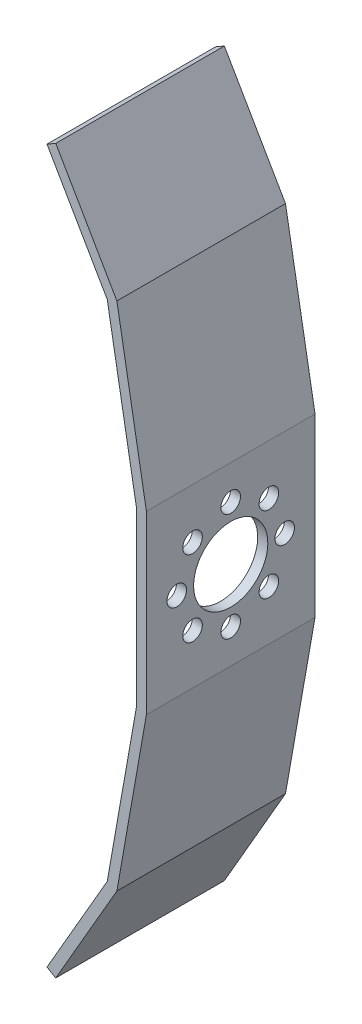
ISO-10303-21;
HEADER;
FILE_DESCRIPTION(('STEP AP214'),'2;1');
FILE_NAME('part.step','',(''),(''),'','','');
FILE_SCHEMA(('AUTOMOTIVE_DESIGN { 1 0 10303 214 1 1 1 1 }'));
ENDSEC;
DATA;
#1=APPLICATION_CONTEXT('core data for automotive mechanical design processes');
#2=APPLICATION_PROTOCOL_DEFINITION('international standard','automotive_design',2000,#1);
#3=PRODUCT_CONTEXT('',#1,'mechanical');
#4=PRODUCT('Part','Part','',(#3));
#5=PRODUCT_RELATED_PRODUCT_CATEGORY('part','',(#4));
#6=PRODUCT_DEFINITION_FORMATION('','',#4);
#7=PRODUCT_DEFINITION_CONTEXT('part definition',#1,'design');
#8=PRODUCT_DEFINITION('design','',#6,#7);
#9=PRODUCT_DEFINITION_SHAPE('','',#8);
#10=(LENGTH_UNIT() NAMED_UNIT(*) SI_UNIT(.MILLI.,.METRE.));
#11=(NAMED_UNIT(*) PLANE_ANGLE_UNIT() SI_UNIT($,.RADIAN.));
#12=(NAMED_UNIT(*) SI_UNIT($,.STERADIAN.) SOLID_ANGLE_UNIT());
#13=UNCERTAINTY_MEASURE_WITH_UNIT(LENGTH_MEASURE(1.E-05),#10,'distance_accuracy_value','');
#14=(GEOMETRIC_REPRESENTATION_CONTEXT(3) GLOBAL_UNCERTAINTY_ASSIGNED_CONTEXT((#13)) GLOBAL_UNIT_ASSIGNED_CONTEXT((#10,
#11,#12)) REPRESENTATION_CONTEXT('',''));
#15=CARTESIAN_POINT('',(0.,0.,0.));
#16=DIRECTION('',(0.,0.,1.));
#17=DIRECTION('',(1.,0.,0.));
#18=AXIS2_PLACEMENT_3D('',#15,#16,#17);
#19=CARTESIAN_POINT('',(-4.9907234945116,-37.2451938253052,25.));
#20=DIRECTION('',(0.866025403784438,-0.500000000000001,0.));
#21=DIRECTION('',(0.500000000000001,0.866025403784438,0.));
#22=AXIS2_PLACEMENT_3D('',#19,#20,#21);
#23=PLANE('',#22);
#24=DIRECTION('',(-0.500000000000001,-0.866025403784438,0.));
#25=VECTOR('',#24,1.);
#26=CARTESIAN_POINT('',(-4.9907234945116,-37.2451938253052,0.));
#27=LINE('',#26,#25);
#28=CARTESIAN_POINT('',(-5.05684611227727,-37.3597215588048,0.));
#29=VERTEX_POINT('',#28);
#30=CARTESIAN_POINT('',(-13.9907234945116,-52.8336510934251,0.));
#31=VERTEX_POINT('',#30);
#32=EDGE_CURVE('E161',#29,#31,#27,.T.);
#33=ORIENTED_EDGE('',*,*,#32,.T.);
#34=DIRECTION('',(0.,0.,-1.));
#35=VECTOR('',#34,1.);
#36=CARTESIAN_POINT('',(-13.9907234945116,-52.8336510934251,25.));
#37=LINE('',#36,#35);
#38=CARTESIAN_POINT('',(-13.9907234945116,-52.8336510934251,25.));
#39=VERTEX_POINT('',#38);
#40=EDGE_CURVE('E11',#39,#31,#37,.T.);
#41=ORIENTED_EDGE('',*,*,#40,.F.);
#42=DIRECTION('',(-0.500000000000001,-0.866025403784438,0.));
#43=VECTOR('',#42,1.);
#44=CARTESIAN_POINT('',(-4.9907234945116,-37.2451938253052,25.));
#45=LINE('',#44,#43);
#46=CARTESIAN_POINT('',(-5.05684611227727,-37.3597215588048,25.));
#47=VERTEX_POINT('',#46);
#48=EDGE_CURVE('E109',#47,#39,#45,.T.);
#49=ORIENTED_EDGE('',*,*,#48,.F.);
#50=DIRECTION('',(0.,0.,-1.));
#51=VECTOR('',#50,1.);
#52=CARTESIAN_POINT('',(-5.05684611227727,-37.3597215588048,25.));
#53=LINE('',#52,#51);
#54=EDGE_CURVE('E157',#47,#29,#53,.T.);
#55=ORIENTED_EDGE('',*,*,#54,.T.);
#56=EDGE_LOOP('',(#33,#41,#49,#55));
#57=FACE_BOUND('',#56,.T.);
#58=ADVANCED_FACE('F39',(#57),#23,.F.);
#59=CARTESIAN_POINT('',(-12.691685388835,-53.5836510934251,25.));
#60=DIRECTION('',(-0.500000000000001,-0.866025403784438,0.));
#61=DIRECTION('',(0.866025403784438,-0.500000000000001,0.));
#62=AXIS2_PLACEMENT_3D('',#59,#60,#61);
#63=PLANE('',#62);
#64=DIRECTION('',(-0.866025403784438,0.500000000000001,0.));
#65=VECTOR('',#64,1.);
#66=CARTESIAN_POINT('',(-12.691685388835,-53.5836510934251,0.));
#67=LINE('',#66,#65);
#68=CARTESIAN_POINT('',(-12.691685388835,-53.5836510934251,0.));
#69=VERTEX_POINT('',#68);
#70=EDGE_CURVE('E164',#69,#31,#67,.T.);
#71=ORIENTED_EDGE('',*,*,#70,.F.);
#72=DIRECTION('',(0.,0.,-1.));
#73=VECTOR('',#72,1.);
#74=CARTESIAN_POINT('',(-12.691685388835,-53.5836510934251,25.));
#75=LINE('',#74,#73);
#76=CARTESIAN_POINT('',(-12.691685388835,-53.5836510934251,25.));
#77=VERTEX_POINT('',#76);
#78=EDGE_CURVE('E48',#77,#69,#75,.T.);
#79=ORIENTED_EDGE('',*,*,#78,.F.);
#80=DIRECTION('',(-0.866025403784438,0.500000000000001,0.));
#81=VECTOR('',#80,1.);
#82=CARTESIAN_POINT('',(-12.691685388835,-53.5836510934251,25.));
#83=LINE('',#82,#81);
#84=EDGE_CURVE('E262',#77,#39,#83,.T.);
#85=ORIENTED_EDGE('',*,*,#84,.T.);
#86=ORIENTED_EDGE('',*,*,#40,.T.);
#87=EDGE_LOOP('',(#71,#79,#85,#86));
#88=FACE_BOUND('',#87,.T.);
#89=ADVANCED_FACE('F249',(#88),#63,.T.);
#90=CARTESIAN_POINT('',(-3.69168538883494,-37.9951938253052,25.));
#91=DIRECTION('',(0.866025403784438,-0.500000000000001,0.));
#92=DIRECTION('',(0.500000000000001,0.866025403784438,0.));
#93=AXIS2_PLACEMENT_3D('',#90,#91,#92);
#94=PLANE('',#93);
#95=DIRECTION('',(-0.500000000000001,-0.866025403784438,0.));
#96=VECTOR('',#95,1.);
#97=CARTESIAN_POINT('',(-3.69168538883494,-37.9951938253052,0.));
#98=LINE('',#97,#96);
#99=CARTESIAN_POINT('',(-3.62556277106927,-37.8806660918056,0.));
#100=VERTEX_POINT('',#99);
#101=EDGE_CURVE('E167',#100,#69,#98,.T.);
#102=ORIENTED_EDGE('',*,*,#101,.F.);
#103=DIRECTION('',(0.,0.,-1.));
#104=VECTOR('',#103,1.);
#105=CARTESIAN_POINT('',(-3.62556277106927,-37.8806660918056,25.));
#106=LINE('',#105,#104);
#107=CARTESIAN_POINT('',(-3.62556277106927,-37.8806660918056,25.));
#108=VERTEX_POINT('',#107);
#109=EDGE_CURVE('E203',#108,#100,#106,.T.);
#110=ORIENTED_EDGE('',*,*,#109,.F.);
#111=DIRECTION('',(-0.500000000000001,-0.866025403784438,0.));
#112=VECTOR('',#111,1.);
#113=CARTESIAN_POINT('',(-3.69168538883494,-37.9951938253052,25.));
#114=LINE('',#113,#112);
#115=EDGE_CURVE('E265',#108,#77,#114,.T.);
#116=ORIENTED_EDGE('',*,*,#115,.T.);
#117=ORIENTED_EDGE('',*,*,#78,.T.);
#118=EDGE_LOOP('',(#102,#110,#116,#117));
#119=FACE_BOUND('',#118,.T.);
#120=ADVANCED_FACE('F254',(#119),#94,.T.);
#121=CARTESIAN_POINT('',(0.738605814759159,-13.1302361332502,25.));
#122=DIRECTION('',(0.984807753012208,-0.173648177666931,0.));
#123=DIRECTION('',(0.173648177666931,0.984807753012208,0.));
#124=AXIS2_PLACEMENT_3D('',#121,#122,#123);
#125=PLANE('',#124);
#126=DIRECTION('',(-0.173648177666931,-0.984807753012208,0.));
#127=VECTOR('',#126,1.);
#128=CARTESIAN_POINT('',(0.738605814759159,-13.1302361332502,0.));
#129=LINE('',#128,#127);
#130=CARTESIAN_POINT('',(0.750000000000003,-13.0656164976444,0.));
#131=VERTEX_POINT('',#130);
#132=EDGE_CURVE('E170',#131,#100,#129,.T.);
#133=ORIENTED_EDGE('',*,*,#132,.F.);
#134=DIRECTION('',(0.,0.,-1.));
#135=VECTOR('',#134,1.);
#136=CARTESIAN_POINT('',(0.750000000000003,-13.0656164976444,25.));
#137=LINE('',#136,#135);
#138=CARTESIAN_POINT('',(0.750000000000003,-13.0656164976444,25.));
#139=VERTEX_POINT('',#138);
#140=EDGE_CURVE('E201',#139,#131,#137,.T.);
#141=ORIENTED_EDGE('',*,*,#140,.F.);
#142=DIRECTION('',(-0.173648177666931,-0.984807753012208,0.));
#143=VECTOR('',#142,1.);
#144=CARTESIAN_POINT('',(0.738605814759159,-13.1302361332502,25.));
#145=LINE('',#144,#143);
#146=EDGE_CURVE('E267',#139,#108,#145,.T.);
#147=ORIENTED_EDGE('',*,*,#146,.T.);
#148=ORIENTED_EDGE('',*,*,#109,.T.);
#149=EDGE_LOOP('',(#133,#141,#147,#148));
#150=FACE_BOUND('',#149,.T.);
#151=ADVANCED_FACE('F317',(#150),#125,.T.);
#152=CARTESIAN_POINT('',(0.75,13.,25.));
#153=DIRECTION('',(1.,0.,0.));
#154=DIRECTION('',(0.,1.,0.));
#155=AXIS2_PLACEMENT_3D('',#152,#153,#154);
#156=PLANE('',#155);
#157=CARTESIAN_POINT('',(0.750000000000002,0.,20.5));
#158=DIRECTION('',(1.,0.,0.));
#159=DIRECTION('',(0.,1.,0.));
#160=AXIS2_PLACEMENT_3D('',#157,#158,#159);
#161=CIRCLE('',#160,1.45);
#162=CARTESIAN_POINT('',(0.750000000000001,1.45,20.5));
#163=VERTEX_POINT('',#162);
#164=EDGE_CURVE('E505',#163,#163,#161,.T.);
#165=ORIENTED_EDGE('',*,*,#164,.F.);
#166=EDGE_LOOP('',(#165));
#167=FACE_BOUND('',#166,.T.);
#168=CARTESIAN_POINT('',(0.750000000000001,5.65685424949247,18.1568542494923));
#169=DIRECTION('',(1.,0.,0.));
#170=DIRECTION('',(0.,1.,0.));
#171=AXIS2_PLACEMENT_3D('',#168,#169,#170);
#172=CIRCLE('',#171,1.45);
#173=CARTESIAN_POINT('',(0.750000000000001,7.10685424949247,18.1568542494923));
#174=VERTEX_POINT('',#173);
#175=EDGE_CURVE('E501',#174,#174,#172,.T.);
#176=ORIENTED_EDGE('',*,*,#175,.F.);
#177=EDGE_LOOP('',(#176));
#178=FACE_BOUND('',#177,.T.);
#179=CARTESIAN_POINT('',(0.750000000000001,8.,12.5));
#180=DIRECTION('',(1.,0.,0.));
#181=DIRECTION('',(0.,1.,0.));
#182=AXIS2_PLACEMENT_3D('',#179,#180,#181);
#183=CIRCLE('',#182,1.45);
#184=CARTESIAN_POINT('',(0.75,9.45,12.5));
#185=VERTEX_POINT('',#184);
#186=EDGE_CURVE('E479',#185,#185,#183,.T.);
#187=ORIENTED_EDGE('',*,*,#186,.F.);
#188=EDGE_LOOP('',(#187));
#189=FACE_BOUND('',#188,.T.);
#190=CARTESIAN_POINT('',(0.750000000000001,5.65685424949235,6.84314575050759));
#191=DIRECTION('',(1.,0.,0.));
#192=DIRECTION('',(0.,1.,0.));
#193=AXIS2_PLACEMENT_3D('',#190,#191,#192);
#194=CIRCLE('',#193,1.45);
#195=CARTESIAN_POINT('',(0.750000000000001,7.10685424949235,6.84314575050759));
#196=VERTEX_POINT('',#195);
#197=EDGE_CURVE('E502',#196,#196,#194,.T.);
#198=ORIENTED_EDGE('',*,*,#197,.F.);
#199=EDGE_LOOP('',(#198));
#200=FACE_BOUND('',#199,.T.);
#201=CARTESIAN_POINT('',(0.750000000000002,0.,4.5));
#202=DIRECTION('',(1.,0.,0.));
#203=DIRECTION('',(0.,1.,0.));
#204=AXIS2_PLACEMENT_3D('',#201,#202,#203);
#205=CIRCLE('',#204,1.45);
#206=CARTESIAN_POINT('',(0.750000000000001,1.44999999999994,4.5));
#207=VERTEX_POINT('',#206);
#208=EDGE_CURVE('E508',#207,#207,#205,.T.);
#209=ORIENTED_EDGE('',*,*,#208,.F.);
#210=EDGE_LOOP('',(#209));
#211=FACE_BOUND('',#210,.T.);
#212=CARTESIAN_POINT('',(0.750000000000002,-5.65685424949243,6.84314575050767));
#213=DIRECTION('',(1.,0.,0.));
#214=DIRECTION('',(0.,1.,0.));
#215=AXIS2_PLACEMENT_3D('',#212,#213,#214);
#216=CIRCLE('',#215,1.45);
#217=CARTESIAN_POINT('',(0.750000000000002,-4.20685424949243,6.84314575050767));
#218=VERTEX_POINT('',#217);
#219=EDGE_CURVE('E521',#218,#218,#216,.T.);
#220=ORIENTED_EDGE('',*,*,#219,.F.);
#221=EDGE_LOOP('',(#220));
#222=FACE_BOUND('',#221,.T.);
#223=CARTESIAN_POINT('',(0.750000000000003,-8.,12.5000000000001));
#224=DIRECTION('',(1.,0.,0.));
#225=DIRECTION('',(0.,1.,0.));
#226=AXIS2_PLACEMENT_3D('',#223,#224,#225);
#227=CIRCLE('',#226,1.45);
#228=CARTESIAN_POINT('',(0.750000000000002,-6.55,12.5000000000001));
#229=VERTEX_POINT('',#228);
#230=EDGE_CURVE('E518',#229,#229,#227,.T.);
#231=ORIENTED_EDGE('',*,*,#230,.F.);
#232=EDGE_LOOP('',(#231));
#233=FACE_BOUND('',#232,.T.);
#234=CARTESIAN_POINT('',(0.750000000000002,-5.65685424949231,18.1568542494925));
#235=DIRECTION('',(1.,0.,0.));
#236=DIRECTION('',(0.,1.,0.));
#237=AXIS2_PLACEMENT_3D('',#234,#235,#236);
#238=CIRCLE('',#237,1.45);
#239=CARTESIAN_POINT('',(0.750000000000002,-4.20685424949231,18.1568542494925));
#240=VERTEX_POINT('',#239);
#241=EDGE_CURVE('E515',#240,#240,#238,.T.);
#242=ORIENTED_EDGE('',*,*,#241,.F.);
#243=EDGE_LOOP('',(#242));
#244=FACE_BOUND('',#243,.T.);
#245=CARTESIAN_POINT('',(0.750000000000002,0.,12.5));
#246=DIRECTION('',(1.,0.,0.));
#247=DIRECTION('',(0.,1.,0.));
#248=AXIS2_PLACEMENT_3D('',#245,#246,#247);
#249=CIRCLE('',#248,5.5);
#250=CARTESIAN_POINT('',(0.750000000000001,5.5,12.5));
#251=VERTEX_POINT('',#250);
#252=EDGE_CURVE('E210',#251,#251,#249,.T.);
#253=ORIENTED_EDGE('',*,*,#252,.F.);
#254=EDGE_LOOP('',(#253));
#255=FACE_BOUND('',#254,.T.);
#256=DIRECTION('',(0.,-1.,0.));
#257=VECTOR('',#256,1.);
#258=CARTESIAN_POINT('',(0.75,13.,0.));
#259=LINE('',#258,#257);
#260=CARTESIAN_POINT('',(0.75,13.0656164976445,0.));
#261=VERTEX_POINT('',#260);
#262=EDGE_CURVE('E173',#261,#131,#259,.T.);
#263=ORIENTED_EDGE('',*,*,#262,.F.);
#264=DIRECTION('',(0.,0.,-1.));
#265=VECTOR('',#264,1.);
#266=CARTESIAN_POINT('',(0.75,13.0656164976445,25.));
#267=LINE('',#266,#265);
#268=CARTESIAN_POINT('',(0.75,13.0656164976445,25.));
#269=VERTEX_POINT('',#268);
#270=EDGE_CURVE('E199',#269,#261,#267,.T.);
#271=ORIENTED_EDGE('',*,*,#270,.F.);
#272=DIRECTION('',(0.,-1.,0.));
#273=VECTOR('',#272,1.);
#274=CARTESIAN_POINT('',(0.75,13.,25.));
#275=LINE('',#274,#273);
#276=EDGE_CURVE('E274',#269,#139,#275,.T.);
#277=ORIENTED_EDGE('',*,*,#276,.T.);
#278=ORIENTED_EDGE('',*,*,#140,.T.);
#279=EDGE_LOOP('',(#263,#271,#277,#278));
#280=FACE_BOUND('',#279,.T.);
#281=ADVANCED_FACE('F313',(#167,#178,#189,#200,#211,#222,#233,#244,#255,#280),#156,.T.);
#282=CARTESIAN_POINT('',(-3.60259862691413,37.7504299585554,25.));
#283=DIRECTION('',(0.984807753012208,0.173648177666931,0.));
#284=DIRECTION('',(-0.173648177666931,0.984807753012208,0.));
#285=AXIS2_PLACEMENT_3D('',#282,#283,#284);
#286=PLANE('',#285);
#287=DIRECTION('',(0.173648177666931,-0.984807753012208,0.));
#288=VECTOR('',#287,1.);
#289=CARTESIAN_POINT('',(-3.60259862691413,37.7504299585554,0.));
#290=LINE('',#289,#288);
#291=CARTESIAN_POINT('',(-3.62556277106928,37.8806660918056,0.));
#292=VERTEX_POINT('',#291);
#293=EDGE_CURVE('E176',#292,#261,#290,.T.);
#294=ORIENTED_EDGE('',*,*,#293,.F.);
#295=DIRECTION('',(0.,0.,-1.));
#296=VECTOR('',#295,1.);
#297=CARTESIAN_POINT('',(-3.62556277106928,37.8806660918056,25.));
#298=LINE('',#297,#296);
#299=CARTESIAN_POINT('',(-3.62556277106928,37.8806660918056,25.));
#300=VERTEX_POINT('',#299);
#301=EDGE_CURVE('E197',#300,#292,#298,.T.);
#302=ORIENTED_EDGE('',*,*,#301,.F.);
#303=DIRECTION('',(0.173648177666931,-0.984807753012208,0.));
#304=VECTOR('',#303,1.);
#305=CARTESIAN_POINT('',(-3.60259862691413,37.7504299585554,25.));
#306=LINE('',#305,#304);
#307=EDGE_CURVE('E277',#300,#269,#306,.T.);
#308=ORIENTED_EDGE('',*,*,#307,.T.);
#309=ORIENTED_EDGE('',*,*,#270,.T.);
#310=EDGE_LOOP('',(#294,#302,#308,#309));
#311=FACE_BOUND('',#310,.T.);
#312=ADVANCED_FACE('F310',(#311),#286,.T.);
#313=CARTESIAN_POINT('',(-12.691685388835,53.5836510934251,25.));
#314=DIRECTION('',(0.866025403784437,0.500000000000002,0.));
#315=DIRECTION('',(-0.500000000000002,0.866025403784437,0.));
#316=AXIS2_PLACEMENT_3D('',#313,#314,#315);
#317=PLANE('',#316);
#318=DIRECTION('',(0.500000000000002,-0.866025403784437,0.));
#319=VECTOR('',#318,1.);
#320=CARTESIAN_POINT('',(-12.691685388835,53.5836510934251,0.));
#321=LINE('',#320,#319);
#322=CARTESIAN_POINT('',(-12.691685388835,53.5836510934251,0.));
#323=VERTEX_POINT('',#322);
#324=EDGE_CURVE('E179',#323,#292,#321,.T.);
#325=ORIENTED_EDGE('',*,*,#324,.F.);
#326=DIRECTION('',(0.,0.,-1.));
#327=VECTOR('',#326,1.);
#328=CARTESIAN_POINT('',(-12.691685388835,53.5836510934251,25.));
#329=LINE('',#328,#327);
#330=CARTESIAN_POINT('',(-12.691685388835,53.5836510934251,25.));
#331=VERTEX_POINT('',#330);
#332=EDGE_CURVE('E195',#331,#323,#329,.T.);
#333=ORIENTED_EDGE('',*,*,#332,.F.);
#334=DIRECTION('',(0.500000000000002,-0.866025403784437,0.));
#335=VECTOR('',#334,1.);
#336=CARTESIAN_POINT('',(-12.691685388835,53.5836510934251,25.));
#337=LINE('',#336,#335);
#338=EDGE_CURVE('E280',#331,#300,#337,.T.);
#339=ORIENTED_EDGE('',*,*,#338,.T.);
#340=ORIENTED_EDGE('',*,*,#301,.T.);
#341=EDGE_LOOP('',(#325,#333,#339,#340));
#342=FACE_BOUND('',#341,.T.);
#343=ADVANCED_FACE('F293',(#342),#317,.T.);
#344=CARTESIAN_POINT('',(-13.9907234945117,52.8336510934251,25.));
#345=DIRECTION('',(-0.500000000000001,0.866025403784438,0.));
#346=DIRECTION('',(-0.866025403784438,-0.500000000000001,0.));
#347=AXIS2_PLACEMENT_3D('',#344,#345,#346);
#348=PLANE('',#347);
#349=DIRECTION('',(0.866025403784438,0.500000000000001,0.));
#350=VECTOR('',#349,1.);
#351=CARTESIAN_POINT('',(-13.9907234945117,52.8336510934251,0.));
#352=LINE('',#351,#350);
#353=CARTESIAN_POINT('',(-13.9907234945117,52.8336510934251,0.));
#354=VERTEX_POINT('',#353);
#355=EDGE_CURVE('E182',#354,#323,#352,.T.);
#356=ORIENTED_EDGE('',*,*,#355,.F.);
#357=DIRECTION('',(0.,0.,-1.));
#358=VECTOR('',#357,1.);
#359=CARTESIAN_POINT('',(-13.9907234945117,52.8336510934251,25.));
#360=LINE('',#359,#358);
#361=CARTESIAN_POINT('',(-13.9907234945117,52.8336510934251,25.));
#362=VERTEX_POINT('',#361);
#363=EDGE_CURVE('E193',#362,#354,#360,.T.);
#364=ORIENTED_EDGE('',*,*,#363,.F.);
#365=DIRECTION('',(0.866025403784438,0.500000000000001,0.));
#366=VECTOR('',#365,1.);
#367=CARTESIAN_POINT('',(-13.9907234945117,52.8336510934251,25.));
#368=LINE('',#367,#366);
#369=EDGE_CURVE('E283',#362,#331,#368,.T.);
#370=ORIENTED_EDGE('',*,*,#369,.T.);
#371=ORIENTED_EDGE('',*,*,#332,.T.);
#372=EDGE_LOOP('',(#356,#364,#370,#371));
#373=FACE_BOUND('',#372,.T.);
#374=ADVANCED_FACE('F287',(#373),#348,.T.);
#375=CARTESIAN_POINT('',(-13.9907234945117,52.8336510934251,25.));
#376=DIRECTION('',(0.866025403784437,0.500000000000002,0.));
#377=DIRECTION('',(-0.500000000000002,0.866025403784437,0.));
#378=AXIS2_PLACEMENT_3D('',#375,#376,#377);
#379=PLANE('',#378);
#380=DIRECTION('',(0.500000000000002,-0.866025403784437,0.));
#381=VECTOR('',#380,1.);
#382=CARTESIAN_POINT('',(-13.9907234945117,52.8336510934251,0.));
#383=LINE('',#382,#381);
#384=CARTESIAN_POINT('',(-5.05684611227729,37.3597215588048,0.));
#385=VERTEX_POINT('',#384);
#386=EDGE_CURVE('E185',#354,#385,#383,.T.);
#387=ORIENTED_EDGE('',*,*,#386,.T.);
#388=DIRECTION('',(0.,0.,-1.));
#389=VECTOR('',#388,1.);
#390=CARTESIAN_POINT('',(-5.05684611227729,37.3597215588048,25.));
#391=LINE('',#390,#389);
#392=CARTESIAN_POINT('',(-5.05684611227729,37.3597215588048,25.));
#393=VERTEX_POINT('',#392);
#394=EDGE_CURVE('E152',#393,#385,#391,.T.);
#395=ORIENTED_EDGE('',*,*,#394,.F.);
#396=DIRECTION('',(0.500000000000002,-0.866025403784437,0.));
#397=VECTOR('',#396,1.);
#398=CARTESIAN_POINT('',(-13.9907234945117,52.8336510934251,25.));
#399=LINE('',#398,#397);
#400=EDGE_CURVE('E143',#362,#393,#399,.T.);
#401=ORIENTED_EDGE('',*,*,#400,.F.);
#402=ORIENTED_EDGE('',*,*,#363,.T.);
#403=EDGE_LOOP('',(#387,#395,#401,#402));
#404=FACE_BOUND('',#403,.T.);
#405=ADVANCED_FACE('F297',(#404),#379,.F.);
#406=CARTESIAN_POINT('',(-5.07981025643244,37.489957692055,25.));
#407=DIRECTION('',(0.984807753012208,0.173648177666931,0.));
#408=DIRECTION('',(-0.173648177666931,0.984807753012208,0.));
#409=AXIS2_PLACEMENT_3D('',#406,#407,#408);
#410=PLANE('',#409);
#411=DIRECTION('',(0.173648177666931,-0.984807753012208,0.));
#412=VECTOR('',#411,1.);
#413=CARTESIAN_POINT('',(-5.07981025643244,37.489957692055,0.));
#414=LINE('',#413,#412);
#415=CARTESIAN_POINT('',(-0.75,12.9343835023556,0.));
#416=VERTEX_POINT('',#415);
#417=EDGE_CURVE('E151',#385,#416,#414,.T.);
#418=ORIENTED_EDGE('',*,*,#417,.T.);
#419=DIRECTION('',(0.,0.,-1.));
#420=VECTOR('',#419,1.);
#421=CARTESIAN_POINT('',(-0.75,12.9343835023556,25.));
#422=LINE('',#421,#420);
#423=CARTESIAN_POINT('',(-0.75,12.9343835023556,25.));
#424=VERTEX_POINT('',#423);
#425=EDGE_CURVE('E148',#424,#416,#422,.T.);
#426=ORIENTED_EDGE('',*,*,#425,.F.);
#427=DIRECTION('',(0.173648177666931,-0.984807753012208,0.));
#428=VECTOR('',#427,1.);
#429=CARTESIAN_POINT('',(-5.07981025643244,37.489957692055,25.));
#430=LINE('',#429,#428);
#431=EDGE_CURVE('E136',#393,#424,#430,.T.);
#432=ORIENTED_EDGE('',*,*,#431,.F.);
#433=ORIENTED_EDGE('',*,*,#394,.T.);
#434=EDGE_LOOP('',(#418,#426,#432,#433));
#435=FACE_BOUND('',#434,.T.);
#436=ADVANCED_FACE('F149',(#435),#410,.F.);
#437=CARTESIAN_POINT('',(-0.75,13.,25.));
#438=DIRECTION('',(1.,0.,0.));
#439=DIRECTION('',(0.,1.,0.));
#440=AXIS2_PLACEMENT_3D('',#437,#438,#439);
#441=PLANE('',#440);
#442=CARTESIAN_POINT('',(-0.749999999999999,0.,20.5));
#443=DIRECTION('',(1.,0.,0.));
#444=DIRECTION('',(0.,1.,0.));
#445=AXIS2_PLACEMENT_3D('',#442,#443,#444);
#446=CIRCLE('',#445,1.45);
#447=CARTESIAN_POINT('',(-0.749999999999999,1.45,20.5));
#448=VERTEX_POINT('',#447);
#449=EDGE_CURVE('E42',#448,#448,#446,.T.);
#450=ORIENTED_EDGE('',*,*,#449,.T.);
#451=EDGE_LOOP('',(#450));
#452=FACE_BOUND('',#451,.T.);
#453=CARTESIAN_POINT('',(-0.749999999999999,5.65685424949247,18.1568542494923));
#454=DIRECTION('',(1.,0.,0.));
#455=DIRECTION('',(0.,1.,0.));
#456=AXIS2_PLACEMENT_3D('',#453,#454,#455);
#457=CIRCLE('',#456,1.45);
#458=CARTESIAN_POINT('',(-0.749999999999999,7.10685424949247,18.1568542494923));
#459=VERTEX_POINT('',#458);
#460=EDGE_CURVE('E227',#459,#459,#457,.T.);
#461=ORIENTED_EDGE('',*,*,#460,.T.);
#462=EDGE_LOOP('',(#461));
#463=FACE_BOUND('',#462,.T.);
#464=CARTESIAN_POINT('',(-0.750000000000001,8.,12.5));
#465=DIRECTION('',(1.,0.,0.));
#466=DIRECTION('',(0.,1.,0.));
#467=AXIS2_PLACEMENT_3D('',#464,#465,#466);
#468=CIRCLE('',#467,1.45);
#469=CARTESIAN_POINT('',(-0.750000000000001,9.45,12.5));
#470=VERTEX_POINT('',#469);
#471=EDGE_CURVE('E225',#470,#470,#468,.T.);
#472=ORIENTED_EDGE('',*,*,#471,.T.);
#473=EDGE_LOOP('',(#472));
#474=FACE_BOUND('',#473,.T.);
#475=CARTESIAN_POINT('',(-0.749999999999999,5.65685424949235,6.84314575050759));
#476=DIRECTION('',(1.,0.,0.));
#477=DIRECTION('',(0.,1.,0.));
#478=AXIS2_PLACEMENT_3D('',#475,#476,#477);
#479=CIRCLE('',#478,1.45);
#480=CARTESIAN_POINT('',(-0.749999999999999,7.10685424949235,6.84314575050759));
#481=VERTEX_POINT('',#480);
#482=EDGE_CURVE('E222',#481,#481,#479,.T.);
#483=ORIENTED_EDGE('',*,*,#482,.T.);
#484=EDGE_LOOP('',(#483));
#485=FACE_BOUND('',#484,.T.);
#486=CARTESIAN_POINT('',(-0.749999999999999,0.,4.5));
#487=DIRECTION('',(1.,0.,0.));
#488=DIRECTION('',(0.,1.,0.));
#489=AXIS2_PLACEMENT_3D('',#486,#487,#488);
#490=CIRCLE('',#489,1.45);
#491=CARTESIAN_POINT('',(-0.749999999999999,1.44999999999994,4.5));
#492=VERTEX_POINT('',#491);
#493=EDGE_CURVE('E219',#492,#492,#490,.T.);
#494=ORIENTED_EDGE('',*,*,#493,.T.);
#495=EDGE_LOOP('',(#494));
#496=FACE_BOUND('',#495,.T.);
#497=CARTESIAN_POINT('',(-0.749999999999999,-5.65685424949243,6.84314575050767));
#498=DIRECTION('',(1.,0.,0.));
#499=DIRECTION('',(0.,1.,0.));
#500=AXIS2_PLACEMENT_3D('',#497,#498,#499);
#501=CIRCLE('',#500,1.45);
#502=CARTESIAN_POINT('',(-0.749999999999999,-4.20685424949243,6.84314575050767));
#503=VERTEX_POINT('',#502);
#504=EDGE_CURVE('E216',#503,#503,#501,.T.);
#505=ORIENTED_EDGE('',*,*,#504,.T.);
#506=EDGE_LOOP('',(#505));
#507=FACE_BOUND('',#506,.T.);
#508=CARTESIAN_POINT('',(-0.749999999999999,-8.,12.5000000000001));
#509=DIRECTION('',(1.,0.,0.));
#510=DIRECTION('',(0.,1.,0.));
#511=AXIS2_PLACEMENT_3D('',#508,#509,#510);
#512=CIRCLE('',#511,1.45);
#513=CARTESIAN_POINT('',(-0.749999999999999,-6.55,12.5000000000001));
#514=VERTEX_POINT('',#513);
#515=EDGE_CURVE('E213',#514,#514,#512,.T.);
#516=ORIENTED_EDGE('',*,*,#515,.T.);
#517=EDGE_LOOP('',(#516));
#518=FACE_BOUND('',#517,.T.);
#519=CARTESIAN_POINT('',(-0.749999999999999,-5.65685424949231,18.1568542494925));
#520=DIRECTION('',(1.,0.,0.));
#521=DIRECTION('',(0.,1.,0.));
#522=AXIS2_PLACEMENT_3D('',#519,#520,#521);
#523=CIRCLE('',#522,1.45);
#524=CARTESIAN_POINT('',(-0.749999999999999,-4.20685424949231,18.1568542494925));
#525=VERTEX_POINT('',#524);
#526=EDGE_CURVE('E209',#525,#525,#523,.T.);
#527=ORIENTED_EDGE('',*,*,#526,.T.);
#528=EDGE_LOOP('',(#527));
#529=FACE_BOUND('',#528,.T.);
#530=CARTESIAN_POINT('',(-0.749999999999999,0.,12.5));
#531=DIRECTION('',(1.,0.,0.));
#532=DIRECTION('',(0.,1.,0.));
#533=AXIS2_PLACEMENT_3D('',#530,#531,#532);
#534=CIRCLE('',#533,5.5);
#535=CARTESIAN_POINT('',(-0.75,5.5,12.5));
#536=VERTEX_POINT('',#535);
#537=EDGE_CURVE('E206',#536,#536,#534,.T.);
#538=ORIENTED_EDGE('',*,*,#537,.T.);
#539=EDGE_LOOP('',(#538));
#540=FACE_BOUND('',#539,.T.);
#541=DIRECTION('',(0.,-1.,0.));
#542=VECTOR('',#541,1.);
#543=CARTESIAN_POINT('',(-0.75,13.,0.));
#544=LINE('',#543,#542);
#545=CARTESIAN_POINT('',(-0.749999999999997,-12.9343835023556,0.));
#546=VERTEX_POINT('',#545);
#547=EDGE_CURVE('E97',#416,#546,#544,.T.);
#548=ORIENTED_EDGE('',*,*,#547,.T.);
#549=DIRECTION('',(0.,0.,-1.));
#550=VECTOR('',#549,1.);
#551=CARTESIAN_POINT('',(-0.749999999999997,-12.9343835023556,25.));
#552=LINE('',#551,#550);
#553=CARTESIAN_POINT('',(-0.749999999999997,-12.9343835023556,25.));
#554=VERTEX_POINT('',#553);
#555=EDGE_CURVE('E153',#554,#546,#552,.T.);
#556=ORIENTED_EDGE('',*,*,#555,.F.);
#557=DIRECTION('',(0.,-1.,0.));
#558=VECTOR('',#557,1.);
#559=CARTESIAN_POINT('',(-0.75,13.,25.));
#560=LINE('',#559,#558);
#561=EDGE_CURVE('E140',#424,#554,#560,.T.);
#562=ORIENTED_EDGE('',*,*,#561,.F.);
#563=ORIENTED_EDGE('',*,*,#425,.T.);
#564=EDGE_LOOP('',(#548,#556,#562,#563));
#565=FACE_BOUND('',#564,.T.);
#566=ADVANCED_FACE('F155',(#452,#463,#474,#485,#496,#507,#518,#529,#540,#565),#441,.F.);
#567=CARTESIAN_POINT('',(-0.738605814759153,-12.8697638667498,25.));
#568=DIRECTION('',(0.984807753012208,-0.173648177666931,0.));
#569=DIRECTION('',(0.173648177666931,0.984807753012208,0.));
#570=AXIS2_PLACEMENT_3D('',#567,#568,#569);
#571=PLANE('',#570);
#572=DIRECTION('',(-0.173648177666931,-0.984807753012208,0.));
#573=VECTOR('',#572,1.);
#574=CARTESIAN_POINT('',(-0.738605814759153,-12.8697638667498,0.));
#575=LINE('',#574,#573);
#576=EDGE_CURVE('E103',#546,#29,#575,.T.);
#577=ORIENTED_EDGE('',*,*,#576,.T.);
#578=ORIENTED_EDGE('',*,*,#54,.F.);
#579=DIRECTION('',(-0.173648177666931,-0.984807753012208,0.));
#580=VECTOR('',#579,1.);
#581=CARTESIAN_POINT('',(-0.738605814759153,-12.8697638667498,25.));
#582=LINE('',#581,#580);
#583=EDGE_CURVE('E57',#554,#47,#582,.T.);
#584=ORIENTED_EDGE('',*,*,#583,.F.);
#585=ORIENTED_EDGE('',*,*,#555,.T.);
#586=EDGE_LOOP('',(#577,#578,#584,#585));
#587=FACE_BOUND('',#586,.T.);
#588=ADVANCED_FACE('F371',(#587),#571,.F.);
#589=CARTESIAN_POINT('',(0.,0.,25.));
#590=DIRECTION('',(0.,0.,-1.));
#591=DIRECTION('',(-1.,0.,0.));
#592=AXIS2_PLACEMENT_3D('',#589,#590,#591);
#593=PLANE('',#592);
#594=ORIENTED_EDGE('',*,*,#48,.T.);
#595=ORIENTED_EDGE('',*,*,#84,.F.);
#596=ORIENTED_EDGE('',*,*,#115,.F.);
#597=ORIENTED_EDGE('',*,*,#146,.F.);
#598=ORIENTED_EDGE('',*,*,#276,.F.);
#599=ORIENTED_EDGE('',*,*,#307,.F.);
#600=ORIENTED_EDGE('',*,*,#338,.F.);
#601=ORIENTED_EDGE('',*,*,#369,.F.);
#602=ORIENTED_EDGE('',*,*,#400,.T.);
#603=ORIENTED_EDGE('',*,*,#431,.T.);
#604=ORIENTED_EDGE('',*,*,#561,.T.);
#605=ORIENTED_EDGE('',*,*,#583,.T.);
#606=EDGE_LOOP('',(#594,#595,#596,#597,#598,#599,#600,#601,#602,#603,#604,#605));
#607=FACE_BOUND('',#606,.T.);
#608=ADVANCED_FACE('F138',(#607),#593,.F.);
#609=CARTESIAN_POINT('',(0.,0.,0.));
#610=DIRECTION('',(0.,0.,-1.));
#611=DIRECTION('',(-1.,0.,0.));
#612=AXIS2_PLACEMENT_3D('',#609,#610,#611);
#613=PLANE('',#612);
#614=ORIENTED_EDGE('',*,*,#32,.F.);
#615=ORIENTED_EDGE('',*,*,#576,.F.);
#616=ORIENTED_EDGE('',*,*,#547,.F.);
#617=ORIENTED_EDGE('',*,*,#417,.F.);
#618=ORIENTED_EDGE('',*,*,#386,.F.);
#619=ORIENTED_EDGE('',*,*,#355,.T.);
#620=ORIENTED_EDGE('',*,*,#324,.T.);
#621=ORIENTED_EDGE('',*,*,#293,.T.);
#622=ORIENTED_EDGE('',*,*,#262,.T.);
#623=ORIENTED_EDGE('',*,*,#132,.T.);
#624=ORIENTED_EDGE('',*,*,#101,.T.);
#625=ORIENTED_EDGE('',*,*,#70,.T.);
#626=EDGE_LOOP('',(#614,#615,#616,#617,#618,#619,#620,#621,#622,#623,#624,#625));
#627=FACE_BOUND('',#626,.T.);
#628=ADVANCED_FACE('F260',(#627),#613,.T.);
#629=CARTESIAN_POINT('',(-9.25,0.,12.5));
#630=DIRECTION('',(1.,0.,0.));
#631=DIRECTION('',(0.,1.,0.));
#632=AXIS2_PLACEMENT_3D('',#629,#630,#631);
#633=CYLINDRICAL_SURFACE('',#632,5.5);
#634=ORIENTED_EDGE('',*,*,#252,.T.);
#635=EDGE_LOOP('',(#634));
#636=FACE_BOUND('',#635,.T.);
#637=ORIENTED_EDGE('',*,*,#537,.F.);
#638=EDGE_LOOP('',(#637));
#639=FACE_BOUND('',#638,.T.);
#640=ADVANCED_FACE('F390',(#636,#639),#633,.F.);
#641=CARTESIAN_POINT('',(-9.25,-5.65685424949231,18.1568542494925));
#642=DIRECTION('',(1.,0.,0.));
#643=DIRECTION('',(0.,1.,0.));
#644=AXIS2_PLACEMENT_3D('',#641,#642,#643);
#645=CYLINDRICAL_SURFACE('',#644,1.45);
#646=ORIENTED_EDGE('',*,*,#241,.T.);
#647=EDGE_LOOP('',(#646));
#648=FACE_BOUND('',#647,.T.);
#649=ORIENTED_EDGE('',*,*,#526,.F.);
#650=EDGE_LOOP('',(#649));
#651=FACE_BOUND('',#650,.T.);
#652=ADVANCED_FACE('F400',(#648,#651),#645,.F.);
#653=CARTESIAN_POINT('',(-9.25,-8.,12.5000000000001));
#654=DIRECTION('',(1.,0.,0.));
#655=DIRECTION('',(0.,1.,0.));
#656=AXIS2_PLACEMENT_3D('',#653,#654,#655);
#657=CYLINDRICAL_SURFACE('',#656,1.45);
#658=ORIENTED_EDGE('',*,*,#230,.T.);
#659=EDGE_LOOP('',(#658));
#660=FACE_BOUND('',#659,.T.);
#661=ORIENTED_EDGE('',*,*,#515,.F.);
#662=EDGE_LOOP('',(#661));
#663=FACE_BOUND('',#662,.T.);
#664=ADVANCED_FACE('F407',(#660,#663),#657,.F.);
#665=CARTESIAN_POINT('',(-9.25,-5.65685424949243,6.84314575050767));
#666=DIRECTION('',(1.,0.,0.));
#667=DIRECTION('',(0.,1.,0.));
#668=AXIS2_PLACEMENT_3D('',#665,#666,#667);
#669=CYLINDRICAL_SURFACE('',#668,1.45);
#670=ORIENTED_EDGE('',*,*,#219,.T.);
#671=EDGE_LOOP('',(#670));
#672=FACE_BOUND('',#671,.T.);
#673=ORIENTED_EDGE('',*,*,#504,.F.);
#674=EDGE_LOOP('',(#673));
#675=FACE_BOUND('',#674,.T.);
#676=ADVANCED_FACE('F414',(#672,#675),#669,.F.);
#677=CARTESIAN_POINT('',(-9.25,0.,4.5));
#678=DIRECTION('',(1.,0.,0.));
#679=DIRECTION('',(0.,1.,0.));
#680=AXIS2_PLACEMENT_3D('',#677,#678,#679);
#681=CYLINDRICAL_SURFACE('',#680,1.45);
#682=ORIENTED_EDGE('',*,*,#208,.T.);
#683=EDGE_LOOP('',(#682));
#684=FACE_BOUND('',#683,.T.);
#685=ORIENTED_EDGE('',*,*,#493,.F.);
#686=EDGE_LOOP('',(#685));
#687=FACE_BOUND('',#686,.T.);
#688=ADVANCED_FACE('F422',(#684,#687),#681,.F.);
#689=CARTESIAN_POINT('',(-9.25,5.65685424949235,6.84314575050759));
#690=DIRECTION('',(1.,0.,0.));
#691=DIRECTION('',(0.,1.,0.));
#692=AXIS2_PLACEMENT_3D('',#689,#690,#691);
#693=CYLINDRICAL_SURFACE('',#692,1.45);
#694=ORIENTED_EDGE('',*,*,#197,.T.);
#695=EDGE_LOOP('',(#694));
#696=FACE_BOUND('',#695,.T.);
#697=ORIENTED_EDGE('',*,*,#482,.F.);
#698=EDGE_LOOP('',(#697));
#699=FACE_BOUND('',#698,.T.);
#700=ADVANCED_FACE('F430',(#696,#699),#693,.F.);
#701=CARTESIAN_POINT('',(-9.25,8.,12.5));
#702=DIRECTION('',(1.,0.,0.));
#703=DIRECTION('',(0.,1.,0.));
#704=AXIS2_PLACEMENT_3D('',#701,#702,#703);
#705=CYLINDRICAL_SURFACE('',#704,1.45);
#706=ORIENTED_EDGE('',*,*,#186,.T.);
#707=EDGE_LOOP('',(#706));
#708=FACE_BOUND('',#707,.T.);
#709=ORIENTED_EDGE('',*,*,#471,.F.);
#710=EDGE_LOOP('',(#709));
#711=FACE_BOUND('',#710,.T.);
#712=ADVANCED_FACE('F243',(#708,#711),#705,.F.);
#713=CARTESIAN_POINT('',(-9.25,5.65685424949247,18.1568542494923));
#714=DIRECTION('',(1.,0.,0.));
#715=DIRECTION('',(0.,1.,0.));
#716=AXIS2_PLACEMENT_3D('',#713,#714,#715);
#717=CYLINDRICAL_SURFACE('',#716,1.45);
#718=ORIENTED_EDGE('',*,*,#175,.T.);
#719=EDGE_LOOP('',(#718));
#720=FACE_BOUND('',#719,.T.);
#721=ORIENTED_EDGE('',*,*,#460,.F.);
#722=EDGE_LOOP('',(#721));
#723=FACE_BOUND('',#722,.T.);
#724=ADVANCED_FACE('F237',(#720,#723),#717,.F.);
#725=CARTESIAN_POINT('',(-9.25,0.,20.5));
#726=DIRECTION('',(1.,0.,0.));
#727=DIRECTION('',(0.,1.,0.));
#728=AXIS2_PLACEMENT_3D('',#725,#726,#727);
#729=CYLINDRICAL_SURFACE('',#728,1.45);
#730=ORIENTED_EDGE('',*,*,#164,.T.);
#731=EDGE_LOOP('',(#730));
#732=FACE_BOUND('',#731,.T.);
#733=ORIENTED_EDGE('',*,*,#449,.F.);
#734=EDGE_LOOP('',(#733));
#735=FACE_BOUND('',#734,.T.);
#736=ADVANCED_FACE('F235',(#732,#735),#729,.F.);
#737=CLOSED_SHELL('',(#58,#89,#120,#151,#281,#312,#343,#374,#405,#436,#566,#588,#608,#628,#640,
#652,#664,#676,#688,#700,#712,#724,#736));
#738=MANIFOLD_SOLID_BREP('B2',#737);
#739=ADVANCED_BREP_SHAPE_REPRESENTATION('',(#18,#738),#14);
#740=SHAPE_DEFINITION_REPRESENTATION(#9,#739);
ENDSEC;
END-ISO-10303-21;
